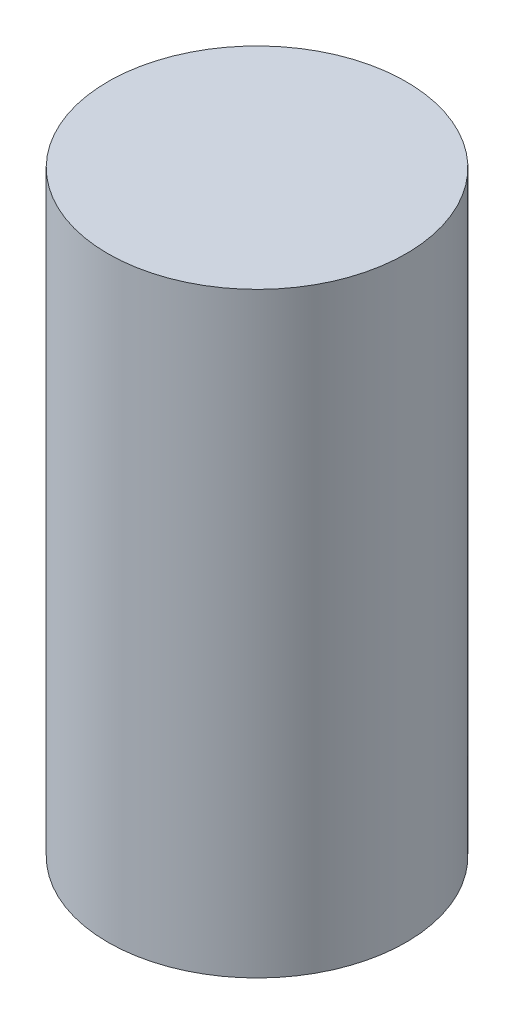
ISO-10303-21;
HEADER;
FILE_DESCRIPTION(('STEP AP214'),'2;1');
FILE_NAME('part.step','',(''),(''),'','','');
FILE_SCHEMA(('AUTOMOTIVE_DESIGN { 1 0 10303 214 1 1 1 1 }'));
ENDSEC;
DATA;
#1=APPLICATION_CONTEXT('core data for automotive mechanical design processes');
#2=APPLICATION_PROTOCOL_DEFINITION('international standard','automotive_design',2000,#1);
#3=PRODUCT_CONTEXT('',#1,'mechanical');
#4=PRODUCT('Part','Part','',(#3));
#5=PRODUCT_RELATED_PRODUCT_CATEGORY('part','',(#4));
#6=PRODUCT_DEFINITION_FORMATION('','',#4);
#7=PRODUCT_DEFINITION_CONTEXT('part definition',#1,'design');
#8=PRODUCT_DEFINITION('design','',#6,#7);
#9=PRODUCT_DEFINITION_SHAPE('','',#8);
#10=(LENGTH_UNIT() NAMED_UNIT(*) SI_UNIT(.MILLI.,.METRE.));
#11=(NAMED_UNIT(*) PLANE_ANGLE_UNIT() SI_UNIT($,.RADIAN.));
#12=(NAMED_UNIT(*) SI_UNIT($,.STERADIAN.) SOLID_ANGLE_UNIT());
#13=UNCERTAINTY_MEASURE_WITH_UNIT(LENGTH_MEASURE(1.E-05),#10,'distance_accuracy_value','');
#14=(GEOMETRIC_REPRESENTATION_CONTEXT(3) GLOBAL_UNCERTAINTY_ASSIGNED_CONTEXT((#13)) GLOBAL_UNIT_ASSIGNED_CONTEXT((#10,
#11,#12)) REPRESENTATION_CONTEXT('',''));
#15=CARTESIAN_POINT('',(0.,0.,0.));
#16=DIRECTION('',(0.,0.,1.));
#17=DIRECTION('',(1.,0.,0.));
#18=AXIS2_PLACEMENT_3D('',#15,#16,#17);
#19=CARTESIAN_POINT('',(0.,4.,0.));
#20=DIRECTION('',(0.,-1.,0.));
#21=DIRECTION('',(0.,0.,-1.));
#22=AXIS2_PLACEMENT_3D('',#19,#20,#21);
#23=CYLINDRICAL_SURFACE('',#22,1.);
#24=CARTESIAN_POINT('',(0.,4.,0.));
#25=DIRECTION('',(0.,1.,0.));
#26=DIRECTION('',(0.,0.,1.));
#27=AXIS2_PLACEMENT_3D('',#24,#25,#26);
#28=CIRCLE('',#27,1.);
#29=CARTESIAN_POINT('',(0.,4.,1.));
#30=VERTEX_POINT('',#29);
#31=EDGE_CURVE('E10',#30,#30,#28,.T.);
#32=ORIENTED_EDGE('',*,*,#31,.F.);
#33=EDGE_LOOP('',(#32));
#34=FACE_BOUND('',#33,.T.);
#35=CARTESIAN_POINT('',(0.,0.,0.));
#36=DIRECTION('',(0.,1.,0.));
#37=DIRECTION('',(0.,0.,1.));
#38=AXIS2_PLACEMENT_3D('',#35,#36,#37);
#39=CIRCLE('',#38,1.);
#40=CARTESIAN_POINT('',(0.,0.,1.));
#41=VERTEX_POINT('',#40);
#42=EDGE_CURVE('E40',#41,#41,#39,.T.);
#43=ORIENTED_EDGE('',*,*,#42,.T.);
#44=EDGE_LOOP('',(#43));
#45=FACE_BOUND('',#44,.T.);
#46=ADVANCED_FACE('F37',(#34,#45),#23,.T.);
#47=CARTESIAN_POINT('',(0.,4.,0.));
#48=DIRECTION('',(0.,1.,0.));
#49=DIRECTION('',(0.,0.,1.));
#50=AXIS2_PLACEMENT_3D('',#47,#48,#49);
#51=PLANE('',#50);
#52=ORIENTED_EDGE('',*,*,#31,.T.);
#53=EDGE_LOOP('',(#52));
#54=FACE_BOUND('',#53,.T.);
#55=ADVANCED_FACE('F54',(#54),#51,.T.);
#56=CARTESIAN_POINT('',(0.,0.,0.));
#57=DIRECTION('',(0.,1.,0.));
#58=DIRECTION('',(0.,0.,1.));
#59=AXIS2_PLACEMENT_3D('',#56,#57,#58);
#60=PLANE('',#59);
#61=ORIENTED_EDGE('',*,*,#42,.F.);
#62=EDGE_LOOP('',(#61));
#63=FACE_BOUND('',#62,.T.);
#64=ADVANCED_FACE('F52',(#63),#60,.F.);
#65=CLOSED_SHELL('',(#46,#55,#64));
#66=MANIFOLD_SOLID_BREP('B2',#65);
#67=ADVANCED_BREP_SHAPE_REPRESENTATION('',(#18,#66),#14);
#68=SHAPE_DEFINITION_REPRESENTATION(#9,#67);
ENDSEC;
END-ISO-10303-21;
